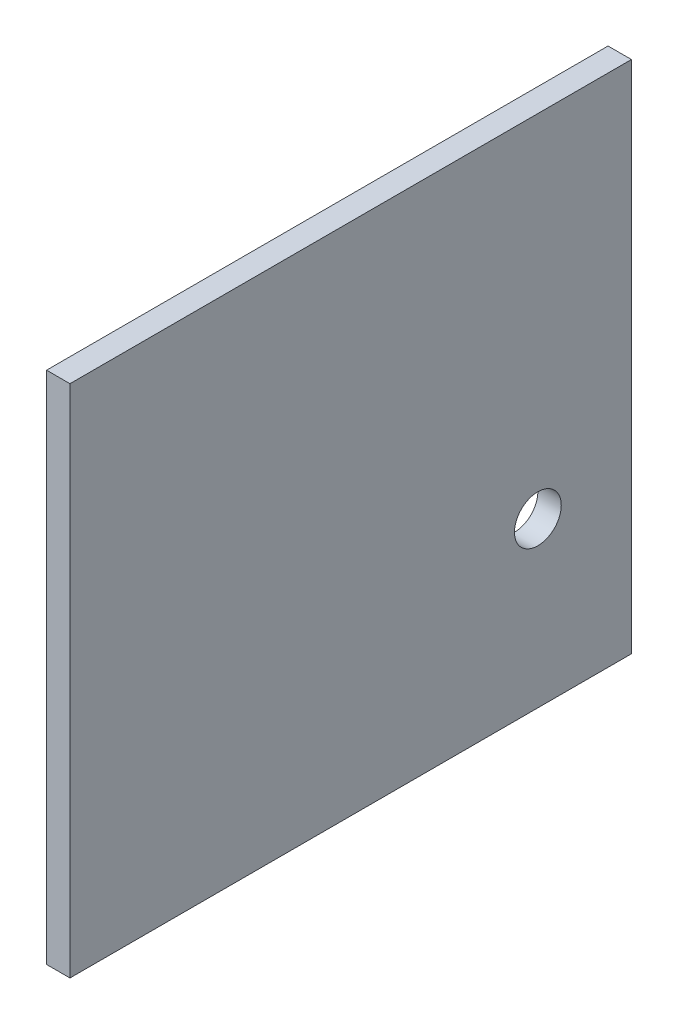
ISO-10303-21;
HEADER;
FILE_DESCRIPTION(('STEP AP214'),'2;1');
FILE_NAME('part.step','',(''),(''),'','','');
FILE_SCHEMA(('AUTOMOTIVE_DESIGN { 1 0 10303 214 1 1 1 1 }'));
ENDSEC;
DATA;
#1=APPLICATION_CONTEXT('core data for automotive mechanical design processes');
#2=APPLICATION_PROTOCOL_DEFINITION('international standard','automotive_design',2000,#1);
#3=PRODUCT_CONTEXT('',#1,'mechanical');
#4=PRODUCT('Part','Part','',(#3));
#5=PRODUCT_RELATED_PRODUCT_CATEGORY('part','',(#4));
#6=PRODUCT_DEFINITION_FORMATION('','',#4);
#7=PRODUCT_DEFINITION_CONTEXT('part definition',#1,'design');
#8=PRODUCT_DEFINITION('design','',#6,#7);
#9=PRODUCT_DEFINITION_SHAPE('','',#8);
#10=(LENGTH_UNIT() NAMED_UNIT(*) SI_UNIT(.MILLI.,.METRE.));
#11=(NAMED_UNIT(*) PLANE_ANGLE_UNIT() SI_UNIT($,.RADIAN.));
#12=(NAMED_UNIT(*) SI_UNIT($,.STERADIAN.) SOLID_ANGLE_UNIT());
#13=UNCERTAINTY_MEASURE_WITH_UNIT(LENGTH_MEASURE(1.E-05),#10,'distance_accuracy_value','');
#14=(GEOMETRIC_REPRESENTATION_CONTEXT(3) GLOBAL_UNCERTAINTY_ASSIGNED_CONTEXT((#13)) GLOBAL_UNIT_ASSIGNED_CONTEXT((#10,
#11,#12)) REPRESENTATION_CONTEXT('',''));
#15=CARTESIAN_POINT('',(0.,0.,0.));
#16=DIRECTION('',(0.,0.,1.));
#17=DIRECTION('',(1.,0.,0.));
#18=AXIS2_PLACEMENT_3D('',#15,#16,#17);
#19=CARTESIAN_POINT('',(5.,55.,-60.));
#20=DIRECTION('',(0.,0.,1.));
#21=DIRECTION('',(0.,-1.,0.));
#22=AXIS2_PLACEMENT_3D('',#19,#20,#21);
#23=PLANE('',#22);
#24=DIRECTION('',(0.,1.,0.));
#25=VECTOR('',#24,1.);
#26=CARTESIAN_POINT('',(0.,55.,-60.));
#27=LINE('',#26,#25);
#28=CARTESIAN_POINT('',(0.,-55.,-60.));
#29=VERTEX_POINT('',#28);
#30=CARTESIAN_POINT('',(0.,55.,-60.));
#31=VERTEX_POINT('',#30);
#32=EDGE_CURVE('E107',#29,#31,#27,.T.);
#33=ORIENTED_EDGE('',*,*,#32,.T.);
#34=DIRECTION('',(-1.,0.,0.));
#35=VECTOR('',#34,1.);
#36=CARTESIAN_POINT('',(5.,55.,-60.));
#37=LINE('',#36,#35);
#38=CARTESIAN_POINT('',(5.,55.,-60.));
#39=VERTEX_POINT('',#38);
#40=EDGE_CURVE('E11',#39,#31,#37,.T.);
#41=ORIENTED_EDGE('',*,*,#40,.F.);
#42=DIRECTION('',(0.,1.,0.));
#43=VECTOR('',#42,1.);
#44=CARTESIAN_POINT('',(5.,55.,-60.));
#45=LINE('',#44,#43);
#46=CARTESIAN_POINT('',(5.,-55.,-60.));
#47=VERTEX_POINT('',#46);
#48=EDGE_CURVE('E91',#47,#39,#45,.T.);
#49=ORIENTED_EDGE('',*,*,#48,.F.);
#50=DIRECTION('',(-1.,0.,0.));
#51=VECTOR('',#50,1.);
#52=CARTESIAN_POINT('',(5.,-55.,-60.));
#53=LINE('',#52,#51);
#54=EDGE_CURVE('E103',#47,#29,#53,.T.);
#55=ORIENTED_EDGE('',*,*,#54,.T.);
#56=EDGE_LOOP('',(#33,#41,#49,#55));
#57=FACE_BOUND('',#56,.T.);
#58=ADVANCED_FACE('F39',(#57),#23,.F.);
#59=CARTESIAN_POINT('',(5.,55.,60.));
#60=DIRECTION('',(0.,-1.,0.));
#61=DIRECTION('',(0.,0.,-1.));
#62=AXIS2_PLACEMENT_3D('',#59,#60,#61);
#63=PLANE('',#62);
#64=DIRECTION('',(0.,0.,1.));
#65=VECTOR('',#64,1.);
#66=CARTESIAN_POINT('',(0.,55.,60.));
#67=LINE('',#66,#65);
#68=CARTESIAN_POINT('',(0.,55.,60.));
#69=VERTEX_POINT('',#68);
#70=EDGE_CURVE('E96',#31,#69,#67,.T.);
#71=ORIENTED_EDGE('',*,*,#70,.T.);
#72=DIRECTION('',(-1.,0.,0.));
#73=VECTOR('',#72,1.);
#74=CARTESIAN_POINT('',(5.,55.,60.));
#75=LINE('',#74,#73);
#76=CARTESIAN_POINT('',(5.,55.,60.));
#77=VERTEX_POINT('',#76);
#78=EDGE_CURVE('E48',#77,#69,#75,.T.);
#79=ORIENTED_EDGE('',*,*,#78,.F.);
#80=DIRECTION('',(0.,0.,1.));
#81=VECTOR('',#80,1.);
#82=CARTESIAN_POINT('',(5.,55.,60.));
#83=LINE('',#82,#81);
#84=EDGE_CURVE('E86',#39,#77,#83,.T.);
#85=ORIENTED_EDGE('',*,*,#84,.F.);
#86=ORIENTED_EDGE('',*,*,#40,.T.);
#87=EDGE_LOOP('',(#71,#79,#85,#86));
#88=FACE_BOUND('',#87,.T.);
#89=ADVANCED_FACE('F95',(#88),#63,.F.);
#90=CARTESIAN_POINT('',(5.,55.,60.));
#91=DIRECTION('',(0.,0.,-1.));
#92=DIRECTION('',(0.,1.,0.));
#93=AXIS2_PLACEMENT_3D('',#90,#91,#92);
#94=PLANE('',#93);
#95=DIRECTION('',(0.,-1.,0.));
#96=VECTOR('',#95,1.);
#97=CARTESIAN_POINT('',(0.,55.,60.));
#98=LINE('',#97,#96);
#99=CARTESIAN_POINT('',(0.,-55.,60.));
#100=VERTEX_POINT('',#99);
#101=EDGE_CURVE('E73',#69,#100,#98,.T.);
#102=ORIENTED_EDGE('',*,*,#101,.T.);
#103=DIRECTION('',(-1.,0.,0.));
#104=VECTOR('',#103,1.);
#105=CARTESIAN_POINT('',(5.,-55.,60.));
#106=LINE('',#105,#104);
#107=CARTESIAN_POINT('',(5.,-55.,60.));
#108=VERTEX_POINT('',#107);
#109=EDGE_CURVE('E98',#108,#100,#106,.T.);
#110=ORIENTED_EDGE('',*,*,#109,.F.);
#111=DIRECTION('',(0.,-1.,0.));
#112=VECTOR('',#111,1.);
#113=CARTESIAN_POINT('',(5.,55.,60.));
#114=LINE('',#113,#112);
#115=EDGE_CURVE('E89',#77,#108,#114,.T.);
#116=ORIENTED_EDGE('',*,*,#115,.F.);
#117=ORIENTED_EDGE('',*,*,#78,.T.);
#118=EDGE_LOOP('',(#102,#110,#116,#117));
#119=FACE_BOUND('',#118,.T.);
#120=ADVANCED_FACE('F99',(#119),#94,.F.);
#121=CARTESIAN_POINT('',(5.,-55.,60.));
#122=DIRECTION('',(0.,1.,0.));
#123=DIRECTION('',(0.,0.,1.));
#124=AXIS2_PLACEMENT_3D('',#121,#122,#123);
#125=PLANE('',#124);
#126=DIRECTION('',(0.,0.,-1.));
#127=VECTOR('',#126,1.);
#128=CARTESIAN_POINT('',(0.,-55.,60.));
#129=LINE('',#128,#127);
#130=EDGE_CURVE('E79',#100,#29,#129,.T.);
#131=ORIENTED_EDGE('',*,*,#130,.T.);
#132=ORIENTED_EDGE('',*,*,#54,.F.);
#133=DIRECTION('',(0.,0.,-1.));
#134=VECTOR('',#133,1.);
#135=CARTESIAN_POINT('',(5.,-55.,60.));
#136=LINE('',#135,#134);
#137=EDGE_CURVE('E56',#108,#47,#136,.T.);
#138=ORIENTED_EDGE('',*,*,#137,.F.);
#139=ORIENTED_EDGE('',*,*,#109,.T.);
#140=EDGE_LOOP('',(#131,#132,#138,#139));
#141=FACE_BOUND('',#140,.T.);
#142=ADVANCED_FACE('F121',(#141),#125,.F.);
#143=CARTESIAN_POINT('',(5.,0.,0.));
#144=DIRECTION('',(1.,0.,0.));
#145=DIRECTION('',(0.,0.,-1.));
#146=AXIS2_PLACEMENT_3D('',#143,#144,#145);
#147=PLANE('',#146);
#148=CARTESIAN_POINT('',(5.,-20.,-40.));
#149=DIRECTION('',(1.,0.,0.));
#150=DIRECTION('',(0.,0.,-1.));
#151=AXIS2_PLACEMENT_3D('',#148,#149,#150);
#152=CIRCLE('',#151,5.);
#153=CARTESIAN_POINT('',(5.,-20.,-45.));
#154=VERTEX_POINT('',#153);
#155=EDGE_CURVE('E128',#154,#154,#152,.T.);
#156=ORIENTED_EDGE('',*,*,#155,.F.);
#157=EDGE_LOOP('',(#156));
#158=FACE_BOUND('',#157,.T.);
#159=ORIENTED_EDGE('',*,*,#48,.T.);
#160=ORIENTED_EDGE('',*,*,#84,.T.);
#161=ORIENTED_EDGE('',*,*,#115,.T.);
#162=ORIENTED_EDGE('',*,*,#137,.T.);
#163=EDGE_LOOP('',(#159,#160,#161,#162));
#164=FACE_BOUND('',#163,.T.);
#165=ADVANCED_FACE('F87',(#158,#164),#147,.T.);
#166=CARTESIAN_POINT('',(0.,0.,0.));
#167=DIRECTION('',(1.,0.,0.));
#168=DIRECTION('',(0.,0.,-1.));
#169=AXIS2_PLACEMENT_3D('',#166,#167,#168);
#170=PLANE('',#169);
#171=CARTESIAN_POINT('',(0.,-20.,-40.));
#172=DIRECTION('',(1.,0.,0.));
#173=DIRECTION('',(0.,0.,-1.));
#174=AXIS2_PLACEMENT_3D('',#171,#172,#173);
#175=CIRCLE('',#174,5.);
#176=CARTESIAN_POINT('',(0.,-20.,-45.));
#177=VERTEX_POINT('',#176);
#178=EDGE_CURVE('E111',#177,#177,#175,.T.);
#179=ORIENTED_EDGE('',*,*,#178,.T.);
#180=EDGE_LOOP('',(#179));
#181=FACE_BOUND('',#180,.T.);
#182=ORIENTED_EDGE('',*,*,#32,.F.);
#183=ORIENTED_EDGE('',*,*,#130,.F.);
#184=ORIENTED_EDGE('',*,*,#101,.F.);
#185=ORIENTED_EDGE('',*,*,#70,.F.);
#186=EDGE_LOOP('',(#182,#183,#184,#185));
#187=FACE_BOUND('',#186,.T.);
#188=ADVANCED_FACE('F124',(#181,#187),#170,.F.);
#189=CARTESIAN_POINT('',(0.,-20.,-40.));
#190=DIRECTION('',(1.,0.,0.));
#191=DIRECTION('',(0.,0.,-1.));
#192=AXIS2_PLACEMENT_3D('',#189,#190,#191);
#193=CYLINDRICAL_SURFACE('',#192,5.);
#194=ORIENTED_EDGE('',*,*,#178,.F.);
#195=EDGE_LOOP('',(#194));
#196=FACE_BOUND('',#195,.T.);
#197=ORIENTED_EDGE('',*,*,#155,.T.);
#198=EDGE_LOOP('',(#197));
#199=FACE_BOUND('',#198,.T.);
#200=ADVANCED_FACE('F137',(#196,#199),#193,.F.);
#201=CLOSED_SHELL('',(#58,#89,#120,#142,#165,#188,#200));
#202=MANIFOLD_SOLID_BREP('B2',#201);
#203=ADVANCED_BREP_SHAPE_REPRESENTATION('',(#18,#202),#14);
#204=SHAPE_DEFINITION_REPRESENTATION(#9,#203);
ENDSEC;
END-ISO-10303-21;
